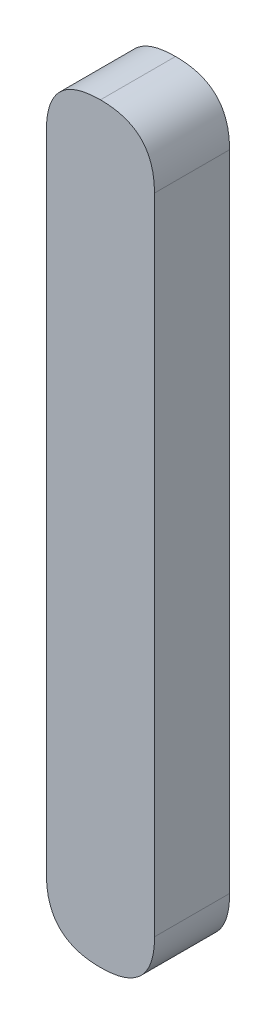
ISO-10303-21;
HEADER;
FILE_DESCRIPTION(('STEP AP214'),'2;1');
FILE_NAME('part.step','',(''),(''),'','','');
FILE_SCHEMA(('AUTOMOTIVE_DESIGN { 1 0 10303 214 1 1 1 1 }'));
ENDSEC;
DATA;
#1=APPLICATION_CONTEXT('core data for automotive mechanical design processes');
#2=APPLICATION_PROTOCOL_DEFINITION('international standard','automotive_design',2000,#1);
#3=PRODUCT_CONTEXT('',#1,'mechanical');
#4=PRODUCT('Part','Part','',(#3));
#5=PRODUCT_RELATED_PRODUCT_CATEGORY('part','',(#4));
#6=PRODUCT_DEFINITION_FORMATION('','',#4);
#7=PRODUCT_DEFINITION_CONTEXT('part definition',#1,'design');
#8=PRODUCT_DEFINITION('design','',#6,#7);
#9=PRODUCT_DEFINITION_SHAPE('','',#8);
#10=(LENGTH_UNIT() NAMED_UNIT(*) SI_UNIT(.MILLI.,.METRE.));
#11=(NAMED_UNIT(*) PLANE_ANGLE_UNIT() SI_UNIT($,.RADIAN.));
#12=(NAMED_UNIT(*) SI_UNIT($,.STERADIAN.) SOLID_ANGLE_UNIT());
#13=UNCERTAINTY_MEASURE_WITH_UNIT(LENGTH_MEASURE(1.E-05),#10,'distance_accuracy_value','');
#14=(GEOMETRIC_REPRESENTATION_CONTEXT(3) GLOBAL_UNCERTAINTY_ASSIGNED_CONTEXT((#13)) GLOBAL_UNIT_ASSIGNED_CONTEXT((#10,
#11,#12)) REPRESENTATION_CONTEXT('',''));
#15=CARTESIAN_POINT('',(0.,0.,0.));
#16=DIRECTION('',(0.,0.,1.));
#17=DIRECTION('',(1.,0.,0.));
#18=AXIS2_PLACEMENT_3D('',#15,#16,#17);
#19=CARTESIAN_POINT('',(0.8,12.2,-2.6));
#20=DIRECTION('',(0.,0.,1.));
#21=DIRECTION('',(1.,0.,0.));
#22=AXIS2_PLACEMENT_3D('',#19,#20,#21);
#23=PLANE('',#22);
#24=DIRECTION('',(0.,1.,0.));
#25=VECTOR('',#24,1.);
#26=CARTESIAN_POINT('',(2.8428,12.89585,-2.6));
#27=LINE('',#26,#25);
#28=CARTESIAN_POINT('',(2.8428,12.03825,-2.6));
#29=VERTEX_POINT('',#28);
#30=CARTESIAN_POINT('',(2.8428,12.89585,-2.6));
#31=VERTEX_POINT('',#30);
#32=EDGE_CURVE('E23',#29,#31,#27,.T.);
#33=ORIENTED_EDGE('',*,*,#32,.F.);
#34=CARTESIAN_POINT('',(2.8428,12.03825,-2.6));
#35=CARTESIAN_POINT('',(2.8428,11.9668,-2.6));
#36=CARTESIAN_POINT('',(2.9148,11.9668,-2.6));
#37=B_SPLINE_CURVE_WITH_KNOTS('',2,(#34,#35,#36),.UNSPECIFIED.,.F.,.F.,(3,3),(0.,1.),.UNSPECIFIED.);
#38=CARTESIAN_POINT('',(2.9148,11.9668,-2.6));
#39=VERTEX_POINT('',#38);
#40=EDGE_CURVE('E121',#29,#39,#37,.T.);
#41=ORIENTED_EDGE('',*,*,#40,.T.);
#42=CARTESIAN_POINT('',(2.9148,11.9668,-2.6));
#43=CARTESIAN_POINT('',(2.9868,11.9668,-2.6));
#44=CARTESIAN_POINT('',(2.9868,12.03825,-2.6));
#45=B_SPLINE_CURVE_WITH_KNOTS('',2,(#42,#43,#44),.UNSPECIFIED.,.F.,.F.,(3,3),(0.,1.),.UNSPECIFIED.);
#46=CARTESIAN_POINT('',(2.9868,12.03825,-2.6));
#47=VERTEX_POINT('',#46);
#48=EDGE_CURVE('E97',#39,#47,#45,.T.);
#49=ORIENTED_EDGE('',*,*,#48,.T.);
#50=DIRECTION('',(0.,1.,0.));
#51=VECTOR('',#50,1.);
#52=CARTESIAN_POINT('',(2.9868,12.03825,-2.6));
#53=LINE('',#52,#51);
#54=CARTESIAN_POINT('',(2.9868,12.89585,-2.6));
#55=VERTEX_POINT('',#54);
#56=EDGE_CURVE('E69',#55,#47,#53,.F.);
#57=ORIENTED_EDGE('',*,*,#56,.F.);
#58=CARTESIAN_POINT('',(2.9868,12.89585,-2.6));
#59=CARTESIAN_POINT('',(2.9868,12.96735,-2.6));
#60=CARTESIAN_POINT('',(2.9148,12.96735,-2.6));
#61=B_SPLINE_CURVE_WITH_KNOTS('',2,(#58,#59,#60),.UNSPECIFIED.,.F.,.F.,(3,3),(0.,1.),.UNSPECIFIED.);
#62=CARTESIAN_POINT('',(2.9148,12.96735,-2.6));
#63=VERTEX_POINT('',#62);
#64=EDGE_CURVE('E72',#55,#63,#61,.T.);
#65=ORIENTED_EDGE('',*,*,#64,.T.);
#66=CARTESIAN_POINT('',(2.9148,12.96735,-2.6));
#67=CARTESIAN_POINT('',(2.8428,12.96735,-2.6));
#68=CARTESIAN_POINT('',(2.8428,12.89585,-2.6));
#69=B_SPLINE_CURVE_WITH_KNOTS('',2,(#66,#67,#68),.UNSPECIFIED.,.F.,.F.,(3,3),(0.,1.),.UNSPECIFIED.);
#70=EDGE_CURVE('E74',#63,#31,#69,.T.);
#71=ORIENTED_EDGE('',*,*,#70,.T.);
#72=EDGE_LOOP('',(#33,#41,#49,#57,#65,#71));
#73=FACE_BOUND('',#72,.T.);
#74=ADVANCED_FACE('F17',(#73),#23,.T.);
#75=CARTESIAN_POINT('',(2.9868,12.03825,-2.7));
#76=DIRECTION('',(1.,0.,0.));
#77=DIRECTION('',(0.,0.,-1.));
#78=AXIS2_PLACEMENT_3D('',#75,#76,#77);
#79=PLANE('',#78);
#80=DIRECTION('',(0.,1.,0.));
#81=VECTOR('',#80,1.);
#82=CARTESIAN_POINT('',(2.9868,12.2,-2.7));
#83=LINE('',#82,#81);
#84=CARTESIAN_POINT('',(2.9868,12.03825,-2.7));
#85=VERTEX_POINT('',#84);
#86=CARTESIAN_POINT('',(2.9868,12.89585,-2.7));
#87=VERTEX_POINT('',#86);
#88=EDGE_CURVE('E100',#85,#87,#83,.T.);
#89=ORIENTED_EDGE('',*,*,#88,.T.);
#90=DIRECTION('',(0.,0.,1.));
#91=VECTOR('',#90,1.);
#92=CARTESIAN_POINT('',(2.9868,12.89585,-2.65));
#93=LINE('',#92,#91);
#94=EDGE_CURVE('E80',#87,#55,#93,.T.);
#95=ORIENTED_EDGE('',*,*,#94,.T.);
#96=ORIENTED_EDGE('',*,*,#56,.T.);
#97=DIRECTION('',(0.,0.,-1.));
#98=VECTOR('',#97,1.);
#99=CARTESIAN_POINT('',(2.9868,12.03825,-2.65));
#100=LINE('',#99,#98);
#101=EDGE_CURVE('E128',#47,#85,#100,.T.);
#102=ORIENTED_EDGE('',*,*,#101,.T.);
#103=EDGE_LOOP('',(#89,#95,#96,#102));
#104=FACE_BOUND('',#103,.T.);
#105=ADVANCED_FACE('F111',(#104),#79,.T.);
#106=CARTESIAN_POINT('',(2.9868,12.89585,-2.7));
#107=CARTESIAN_POINT('',(2.9868,12.96735,-2.7));
#108=CARTESIAN_POINT('',(2.9148,12.96735,-2.7));
#109=CARTESIAN_POINT('',(2.9868,12.89585,-2.6));
#110=CARTESIAN_POINT('',(2.9868,12.96735,-2.6));
#111=CARTESIAN_POINT('',(2.9148,12.96735,-2.6));
#112=B_SPLINE_SURFACE_WITH_KNOTS('',1,2,((#106,#107,#108),(#109,#110,#111)),.UNSPECIFIED.,.F.,
.F.,.F.,(2,2),(3,3),(0.,1.),(0.,1.),.UNSPECIFIED.);
#113=CARTESIAN_POINT('',(2.9868,12.89585,-2.7));
#114=CARTESIAN_POINT('',(2.9868,12.96735,-2.7));
#115=CARTESIAN_POINT('',(2.9148,12.96735,-2.7));
#116=B_SPLINE_CURVE_WITH_KNOTS('',2,(#113,#114,#115),.UNSPECIFIED.,.F.,.F.,(3,3),(0.,1.),.UNSPECIFIED.);
#117=CARTESIAN_POINT('',(2.9148,12.96735,-2.7));
#118=VERTEX_POINT('',#117);
#119=EDGE_CURVE('E91',#87,#118,#116,.T.);
#120=DIRECTION('',(0.,0.,1.));
#121=VECTOR('',#120,1.);
#122=CARTESIAN_POINT('',(2.9148,12.96735,-2.65));
#123=LINE('',#122,#121);
#124=EDGE_CURVE('E79',#118,#63,#123,.T.);
#125=ORIENTED_EDGE('',*,*,#94,.F.);
#126=ORIENTED_EDGE('',*,*,#119,.T.);
#127=ORIENTED_EDGE('',*,*,#124,.T.);
#128=ORIENTED_EDGE('',*,*,#64,.F.);
#129=EDGE_LOOP('',(#125,#126,#127,#128));
#130=FACE_BOUND('',#129,.T.);
#131=ADVANCED_FACE('F89',(#130),#112,.F.);
#132=CARTESIAN_POINT('',(2.9148,12.96735,-2.7));
#133=CARTESIAN_POINT('',(2.8428,12.96735,-2.7));
#134=CARTESIAN_POINT('',(2.8428,12.89585,-2.7));
#135=CARTESIAN_POINT('',(2.9148,12.96735,-2.6));
#136=CARTESIAN_POINT('',(2.8428,12.96735,-2.6));
#137=CARTESIAN_POINT('',(2.8428,12.89585,-2.6));
#138=B_SPLINE_SURFACE_WITH_KNOTS('',1,2,((#132,#133,#134),(#135,#136,#137)),.UNSPECIFIED.,.F.,
.F.,.F.,(2,2),(3,3),(0.,1.),(0.,1.),.UNSPECIFIED.);
#139=CARTESIAN_POINT('',(2.9148,12.96735,-2.7));
#140=CARTESIAN_POINT('',(2.8428,12.96735,-2.7));
#141=CARTESIAN_POINT('',(2.8428,12.89585,-2.7));
#142=B_SPLINE_CURVE_WITH_KNOTS('',2,(#139,#140,#141),.UNSPECIFIED.,.F.,.F.,(3,3),(0.,1.),.UNSPECIFIED.);
#143=CARTESIAN_POINT('',(2.8428,12.89585,-2.7));
#144=VERTEX_POINT('',#143);
#145=EDGE_CURVE('E154',#118,#144,#142,.T.);
#146=DIRECTION('',(0.,0.,1.));
#147=VECTOR('',#146,1.);
#148=CARTESIAN_POINT('',(2.8428,12.89585,-2.7));
#149=LINE('',#148,#147);
#150=EDGE_CURVE('E86',#31,#144,#149,.F.);
#151=ORIENTED_EDGE('',*,*,#124,.F.);
#152=ORIENTED_EDGE('',*,*,#145,.T.);
#153=ORIENTED_EDGE('',*,*,#150,.F.);
#154=ORIENTED_EDGE('',*,*,#70,.F.);
#155=EDGE_LOOP('',(#151,#152,#153,#154));
#156=FACE_BOUND('',#155,.T.);
#157=ADVANCED_FACE('F83',(#156),#138,.F.);
#158=CARTESIAN_POINT('',(2.8428,12.89585,-2.7));
#159=DIRECTION('',(-1.,0.,0.));
#160=DIRECTION('',(0.,0.,1.));
#161=AXIS2_PLACEMENT_3D('',#158,#159,#160);
#162=PLANE('',#161);
#163=DIRECTION('',(0.,1.,0.));
#164=VECTOR('',#163,1.);
#165=CARTESIAN_POINT('',(2.8428,12.2,-2.7));
#166=LINE('',#165,#164);
#167=CARTESIAN_POINT('',(2.8428,12.03825,-2.7));
#168=VERTEX_POINT('',#167);
#169=EDGE_CURVE('E150',#144,#168,#166,.F.);
#170=ORIENTED_EDGE('',*,*,#169,.T.);
#171=DIRECTION('',(0.,0.,1.));
#172=VECTOR('',#171,1.);
#173=CARTESIAN_POINT('',(2.8428,12.03825,-2.65));
#174=LINE('',#173,#172);
#175=EDGE_CURVE('E129',#168,#29,#174,.T.);
#176=ORIENTED_EDGE('',*,*,#175,.T.);
#177=ORIENTED_EDGE('',*,*,#32,.T.);
#178=ORIENTED_EDGE('',*,*,#150,.T.);
#179=EDGE_LOOP('',(#170,#176,#177,#178));
#180=FACE_BOUND('',#179,.T.);
#181=ADVANCED_FACE('F148',(#180),#162,.T.);
#182=CARTESIAN_POINT('',(2.8428,12.03825,-2.7));
#183=CARTESIAN_POINT('',(2.8428,11.9668,-2.7));
#184=CARTESIAN_POINT('',(2.9148,11.9668,-2.7));
#185=CARTESIAN_POINT('',(2.8428,12.03825,-2.6));
#186=CARTESIAN_POINT('',(2.8428,11.9668,-2.6));
#187=CARTESIAN_POINT('',(2.9148,11.9668,-2.6));
#188=B_SPLINE_SURFACE_WITH_KNOTS('',1,2,((#182,#183,#184),(#185,#186,#187)),.UNSPECIFIED.,.F.,
.F.,.F.,(2,2),(3,3),(0.,1.),(0.,1.),.UNSPECIFIED.);
#189=CARTESIAN_POINT('',(2.8428,12.03825,-2.7));
#190=CARTESIAN_POINT('',(2.8428,11.9668,-2.7));
#191=CARTESIAN_POINT('',(2.9148,11.9668,-2.7));
#192=B_SPLINE_CURVE_WITH_KNOTS('',2,(#189,#190,#191),.UNSPECIFIED.,.F.,.F.,(3,3),(0.,1.),.UNSPECIFIED.);
#193=CARTESIAN_POINT('',(2.9148,11.9668,-2.7));
#194=VERTEX_POINT('',#193);
#195=EDGE_CURVE('E29',#168,#194,#192,.T.);
#196=DIRECTION('',(0.,0.,1.));
#197=VECTOR('',#196,1.);
#198=CARTESIAN_POINT('',(2.9148,11.9668,-2.65));
#199=LINE('',#198,#197);
#200=EDGE_CURVE('E37',#194,#39,#199,.T.);
#201=ORIENTED_EDGE('',*,*,#175,.F.);
#202=ORIENTED_EDGE('',*,*,#195,.T.);
#203=ORIENTED_EDGE('',*,*,#200,.T.);
#204=ORIENTED_EDGE('',*,*,#40,.F.);
#205=EDGE_LOOP('',(#201,#202,#203,#204));
#206=FACE_BOUND('',#205,.T.);
#207=ADVANCED_FACE('F143',(#206),#188,.F.);
#208=CARTESIAN_POINT('',(2.9148,11.9668,-2.7));
#209=CARTESIAN_POINT('',(2.9868,11.9668,-2.7));
#210=CARTESIAN_POINT('',(2.9868,12.03825,-2.7));
#211=CARTESIAN_POINT('',(2.9148,11.9668,-2.6));
#212=CARTESIAN_POINT('',(2.9868,11.9668,-2.6));
#213=CARTESIAN_POINT('',(2.9868,12.03825,-2.6));
#214=B_SPLINE_SURFACE_WITH_KNOTS('',1,2,((#208,#209,#210),(#211,#212,#213)),.UNSPECIFIED.,.F.,
.F.,.F.,(2,2),(3,3),(0.,1.),(0.,1.),.UNSPECIFIED.);
#215=CARTESIAN_POINT('',(2.9148,11.9668,-2.7));
#216=CARTESIAN_POINT('',(2.9868,11.9668,-2.7));
#217=CARTESIAN_POINT('',(2.9868,12.03825,-2.7));
#218=B_SPLINE_CURVE_WITH_KNOTS('',2,(#215,#216,#217),.UNSPECIFIED.,.F.,.F.,(3,3),(0.,1.),.UNSPECIFIED.);
#219=EDGE_CURVE('E11',#194,#85,#218,.T.);
#220=ORIENTED_EDGE('',*,*,#200,.F.);
#221=ORIENTED_EDGE('',*,*,#219,.T.);
#222=ORIENTED_EDGE('',*,*,#101,.F.);
#223=ORIENTED_EDGE('',*,*,#48,.F.);
#224=EDGE_LOOP('',(#220,#221,#222,#223));
#225=FACE_BOUND('',#224,.T.);
#226=ADVANCED_FACE('F19',(#225),#214,.F.);
#227=CARTESIAN_POINT('',(0.8,12.2,-2.7));
#228=DIRECTION('',(0.,0.,1.));
#229=DIRECTION('',(1.,0.,0.));
#230=AXIS2_PLACEMENT_3D('',#227,#228,#229);
#231=PLANE('',#230);
#232=ORIENTED_EDGE('',*,*,#195,.F.);
#233=ORIENTED_EDGE('',*,*,#169,.F.);
#234=ORIENTED_EDGE('',*,*,#145,.F.);
#235=ORIENTED_EDGE('',*,*,#119,.F.);
#236=ORIENTED_EDGE('',*,*,#88,.F.);
#237=ORIENTED_EDGE('',*,*,#219,.F.);
#238=EDGE_LOOP('',(#232,#233,#234,#235,#236,#237));
#239=FACE_BOUND('',#238,.T.);
#240=ADVANCED_FACE('F160',(#239),#231,.F.);
#241=CLOSED_SHELL('',(#74,#105,#131,#157,#181,#207,#226,#240));
#242=MANIFOLD_SOLID_BREP('B1',#241);
#243=ADVANCED_BREP_SHAPE_REPRESENTATION('',(#18,#242),#14);
#244=SHAPE_DEFINITION_REPRESENTATION(#9,#243);
ENDSEC;
END-ISO-10303-21;
